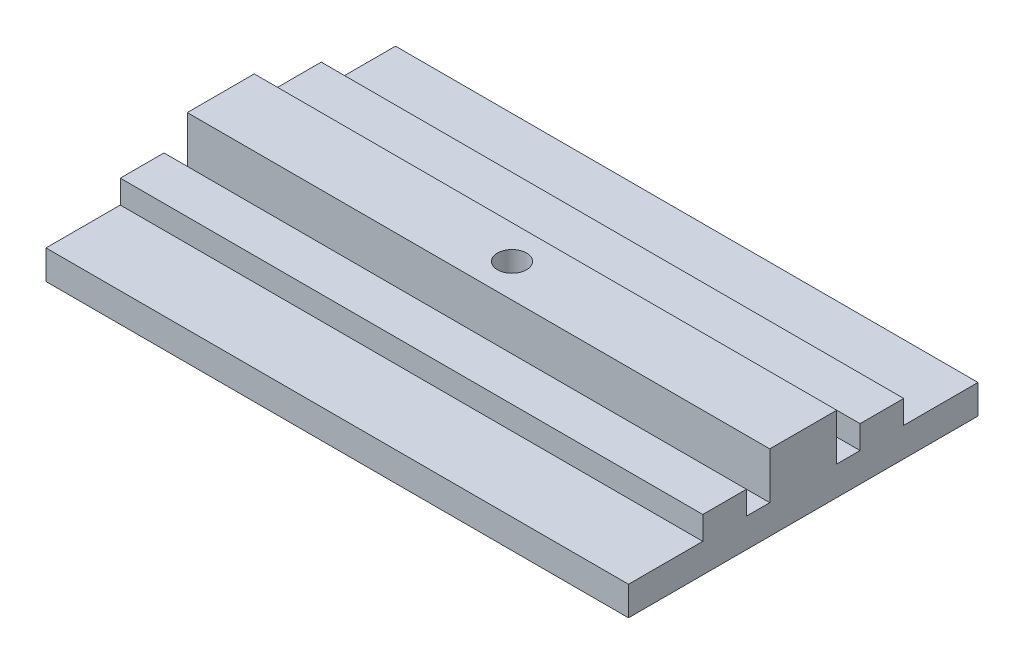
ISO-10303-21;
HEADER;
FILE_DESCRIPTION(('STEP AP214'),'2;1');
FILE_NAME('part.step','',(''),(''),'','','');
FILE_SCHEMA(('AUTOMOTIVE_DESIGN { 1 0 10303 214 1 1 1 1 }'));
ENDSEC;
DATA;
#1=APPLICATION_CONTEXT('core data for automotive mechanical design processes');
#2=APPLICATION_PROTOCOL_DEFINITION('international standard','automotive_design',2000,#1);
#3=PRODUCT_CONTEXT('',#1,'mechanical');
#4=PRODUCT('Part','Part','',(#3));
#5=PRODUCT_RELATED_PRODUCT_CATEGORY('part','',(#4));
#6=PRODUCT_DEFINITION_FORMATION('','',#4);
#7=PRODUCT_DEFINITION_CONTEXT('part definition',#1,'design');
#8=PRODUCT_DEFINITION('design','',#6,#7);
#9=PRODUCT_DEFINITION_SHAPE('','',#8);
#10=(LENGTH_UNIT() NAMED_UNIT(*) SI_UNIT(.MILLI.,.METRE.));
#11=(NAMED_UNIT(*) PLANE_ANGLE_UNIT() SI_UNIT($,.RADIAN.));
#12=(NAMED_UNIT(*) SI_UNIT($,.STERADIAN.) SOLID_ANGLE_UNIT());
#13=UNCERTAINTY_MEASURE_WITH_UNIT(LENGTH_MEASURE(1.E-05),#10,'distance_accuracy_value','');
#14=(GEOMETRIC_REPRESENTATION_CONTEXT(3) GLOBAL_UNCERTAINTY_ASSIGNED_CONTEXT((#13)) GLOBAL_UNIT_ASSIGNED_CONTEXT((#10,
#11,#12)) REPRESENTATION_CONTEXT('',''));
#15=CARTESIAN_POINT('',(0.,0.,0.));
#16=DIRECTION('',(0.,0.,1.));
#17=DIRECTION('',(1.,0.,0.));
#18=AXIS2_PLACEMENT_3D('',#15,#16,#17);
#19=CARTESIAN_POINT('',(0.,10.,0.));
#20=DIRECTION('',(0.,-1.,0.));
#21=DIRECTION('',(0.,0.,-1.));
#22=AXIS2_PLACEMENT_3D('',#19,#20,#21);
#23=PLANE('',#22);
#24=DIRECTION('',(1.,0.,0.));
#25=VECTOR('',#24,1.);
#26=CARTESIAN_POINT('',(-100.,10.,11.5));
#27=LINE('',#26,#25);
#28=CARTESIAN_POINT('',(-100.,10.,11.5));
#29=VERTEX_POINT('',#28);
#30=CARTESIAN_POINT('',(100.,10.,11.5));
#31=VERTEX_POINT('',#30);
#32=EDGE_CURVE('E180',#29,#31,#27,.T.);
#33=ORIENTED_EDGE('',*,*,#32,.F.);
#34=DIRECTION('',(0.,0.,1.));
#35=VECTOR('',#34,1.);
#36=CARTESIAN_POINT('',(-100.,10.,60.));
#37=LINE('',#36,#35);
#38=CARTESIAN_POINT('',(-100.,10.,19.499));
#39=VERTEX_POINT('',#38);
#40=EDGE_CURVE('E263',#29,#39,#37,.T.);
#41=ORIENTED_EDGE('',*,*,#40,.T.);
#42=DIRECTION('',(-1.,0.,0.));
#43=VECTOR('',#42,1.);
#44=CARTESIAN_POINT('',(-100.,10.,19.499));
#45=LINE('',#44,#43);
#46=CARTESIAN_POINT('',(100.,10.,19.499));
#47=VERTEX_POINT('',#46);
#48=EDGE_CURVE('E213',#47,#39,#45,.T.);
#49=ORIENTED_EDGE('',*,*,#48,.F.);
#50=DIRECTION('',(0.,0.,-1.));
#51=VECTOR('',#50,1.);
#52=CARTESIAN_POINT('',(100.,10.,60.));
#53=LINE('',#52,#51);
#54=EDGE_CURVE('E66',#47,#31,#53,.T.);
#55=ORIENTED_EDGE('',*,*,#54,.T.);
#56=EDGE_LOOP('',(#33,#41,#49,#55));
#57=FACE_BOUND('',#56,.T.);
#58=ADVANCED_FACE('F43',(#57),#23,.F.);
#59=CARTESIAN_POINT('',(-100.,10.,-19.499));
#60=VERTEX_POINT('',#59);
#61=CARTESIAN_POINT('',(-100.,10.,-11.5));
#62=VERTEX_POINT('',#61);
#63=EDGE_CURVE('E262',#60,#62,#37,.T.);
#64=ORIENTED_EDGE('',*,*,#63,.T.);
#65=DIRECTION('',(1.,0.,0.));
#66=VECTOR('',#65,1.);
#67=CARTESIAN_POINT('',(-100.,10.,-11.5));
#68=LINE('',#67,#66);
#69=CARTESIAN_POINT('',(100.,10.,-11.5));
#70=VERTEX_POINT('',#69);
#71=EDGE_CURVE('E58',#62,#70,#68,.T.);
#72=ORIENTED_EDGE('',*,*,#71,.T.);
#73=CARTESIAN_POINT('',(100.,10.,-19.499));
#74=VERTEX_POINT('',#73);
#75=EDGE_CURVE('E255',#70,#74,#53,.T.);
#76=ORIENTED_EDGE('',*,*,#75,.T.);
#77=DIRECTION('',(1.,0.,0.));
#78=VECTOR('',#77,1.);
#79=CARTESIAN_POINT('',(-100.,10.,-19.499));
#80=LINE('',#79,#78);
#81=EDGE_CURVE('E229',#60,#74,#80,.T.);
#82=ORIENTED_EDGE('',*,*,#81,.F.);
#83=EDGE_LOOP('',(#64,#72,#76,#82));
#84=FACE_BOUND('',#83,.T.);
#85=ADVANCED_FACE('F306',(#84),#23,.F.);
#86=DIRECTION('',(1.,0.,0.));
#87=VECTOR('',#86,1.);
#88=CARTESIAN_POINT('',(-100.,10.,34.499));
#89=LINE('',#88,#87);
#90=CARTESIAN_POINT('',(-100.,10.,34.499));
#91=VERTEX_POINT('',#90);
#92=CARTESIAN_POINT('',(100.,10.,34.499));
#93=VERTEX_POINT('',#92);
#94=EDGE_CURVE('E210',#91,#93,#89,.T.);
#95=ORIENTED_EDGE('',*,*,#94,.F.);
#96=CARTESIAN_POINT('',(-100.,10.,60.));
#97=VERTEX_POINT('',#96);
#98=EDGE_CURVE('E258',#91,#97,#37,.T.);
#99=ORIENTED_EDGE('',*,*,#98,.T.);
#100=DIRECTION('',(1.,0.,0.));
#101=VECTOR('',#100,1.);
#102=CARTESIAN_POINT('',(-100.,10.,60.));
#103=LINE('',#102,#101);
#104=CARTESIAN_POINT('',(100.,10.,60.));
#105=VERTEX_POINT('',#104);
#106=EDGE_CURVE('E261',#97,#105,#103,.T.);
#107=ORIENTED_EDGE('',*,*,#106,.T.);
#108=EDGE_CURVE('E252',#105,#93,#53,.T.);
#109=ORIENTED_EDGE('',*,*,#108,.T.);
#110=EDGE_LOOP('',(#95,#99,#107,#109));
#111=FACE_BOUND('',#110,.T.);
#112=ADVANCED_FACE('F300',(#111),#23,.F.);
#113=DIRECTION('',(-1.,0.,0.));
#114=VECTOR('',#113,1.);
#115=CARTESIAN_POINT('',(-100.,10.,-34.499));
#116=LINE('',#115,#114);
#117=CARTESIAN_POINT('',(100.,10.,-34.499));
#118=VERTEX_POINT('',#117);
#119=CARTESIAN_POINT('',(-100.,10.,-34.499));
#120=VERTEX_POINT('',#119);
#121=EDGE_CURVE('E217',#118,#120,#116,.T.);
#122=ORIENTED_EDGE('',*,*,#121,.F.);
#123=CARTESIAN_POINT('',(100.,10.,-60.));
#124=VERTEX_POINT('',#123);
#125=EDGE_CURVE('E256',#118,#124,#53,.T.);
#126=ORIENTED_EDGE('',*,*,#125,.T.);
#127=DIRECTION('',(-1.,0.,0.));
#128=VECTOR('',#127,1.);
#129=CARTESIAN_POINT('',(-100.,10.,-60.));
#130=LINE('',#129,#128);
#131=CARTESIAN_POINT('',(-100.,10.,-60.));
#132=VERTEX_POINT('',#131);
#133=EDGE_CURVE('E254',#124,#132,#130,.T.);
#134=ORIENTED_EDGE('',*,*,#133,.T.);
#135=EDGE_CURVE('E259',#132,#120,#37,.T.);
#136=ORIENTED_EDGE('',*,*,#135,.T.);
#137=EDGE_LOOP('',(#122,#126,#134,#136));
#138=FACE_BOUND('',#137,.T.);
#139=ADVANCED_FACE('F322',(#138),#23,.F.);
#140=CARTESIAN_POINT('',(100.,10.,60.));
#141=DIRECTION('',(-1.,0.,0.));
#142=DIRECTION('',(0.,0.,1.));
#143=AXIS2_PLACEMENT_3D('',#140,#141,#142);
#144=PLANE('',#143);
#145=DIRECTION('',(0.,0.,-1.));
#146=VECTOR('',#145,1.);
#147=CARTESIAN_POINT('',(100.,0.,60.));
#148=LINE('',#147,#146);
#149=CARTESIAN_POINT('',(100.,0.,60.));
#150=VERTEX_POINT('',#149);
#151=CARTESIAN_POINT('',(100.,0.,-60.));
#152=VERTEX_POINT('',#151);
#153=EDGE_CURVE('E251',#150,#152,#148,.T.);
#154=ORIENTED_EDGE('',*,*,#153,.T.);
#155=DIRECTION('',(0.,-1.,0.));
#156=VECTOR('',#155,1.);
#157=CARTESIAN_POINT('',(100.,10.,-60.));
#158=LINE('',#157,#156);
#159=EDGE_CURVE('E11',#124,#152,#158,.T.);
#160=ORIENTED_EDGE('',*,*,#159,.F.);
#161=ORIENTED_EDGE('',*,*,#125,.F.);
#162=DIRECTION('',(0.,-1.,0.));
#163=VECTOR('',#162,1.);
#164=CARTESIAN_POINT('',(100.,18.,-34.499));
#165=LINE('',#164,#163);
#166=CARTESIAN_POINT('',(100.,18.,-34.499));
#167=VERTEX_POINT('',#166);
#168=EDGE_CURVE('E248',#167,#118,#165,.T.);
#169=ORIENTED_EDGE('',*,*,#168,.F.);
#170=DIRECTION('',(0.,0.,-1.));
#171=VECTOR('',#170,1.);
#172=CARTESIAN_POINT('',(100.,18.,-34.499));
#173=LINE('',#172,#171);
#174=CARTESIAN_POINT('',(100.,18.,-19.499));
#175=VERTEX_POINT('',#174);
#176=EDGE_CURVE('E225',#175,#167,#173,.T.);
#177=ORIENTED_EDGE('',*,*,#176,.F.);
#178=DIRECTION('',(0.,-1.,0.));
#179=VECTOR('',#178,1.);
#180=CARTESIAN_POINT('',(100.,18.,-19.499));
#181=LINE('',#180,#179);
#182=EDGE_CURVE('E235',#175,#74,#181,.T.);
#183=ORIENTED_EDGE('',*,*,#182,.T.);
#184=ORIENTED_EDGE('',*,*,#75,.F.);
#185=DIRECTION('',(0.,-1.,0.));
#186=VECTOR('',#185,1.);
#187=CARTESIAN_POINT('',(100.,26.,-11.5));
#188=LINE('',#187,#186);
#189=CARTESIAN_POINT('',(100.,26.,-11.5));
#190=VERTEX_POINT('',#189);
#191=EDGE_CURVE('E165',#190,#70,#188,.T.);
#192=ORIENTED_EDGE('',*,*,#191,.F.);
#193=DIRECTION('',(0.,0.,-1.));
#194=VECTOR('',#193,1.);
#195=CARTESIAN_POINT('',(100.,26.,11.5));
#196=LINE('',#195,#194);
#197=CARTESIAN_POINT('',(100.,26.,11.5));
#198=VERTEX_POINT('',#197);
#199=EDGE_CURVE('E173',#198,#190,#196,.T.);
#200=ORIENTED_EDGE('',*,*,#199,.F.);
#201=DIRECTION('',(0.,-1.,0.));
#202=VECTOR('',#201,1.);
#203=CARTESIAN_POINT('',(100.,26.,11.5));
#204=LINE('',#203,#202);
#205=EDGE_CURVE('E191',#198,#31,#204,.T.);
#206=ORIENTED_EDGE('',*,*,#205,.T.);
#207=ORIENTED_EDGE('',*,*,#54,.F.);
#208=DIRECTION('',(0.,-1.,0.));
#209=VECTOR('',#208,1.);
#210=CARTESIAN_POINT('',(100.,18.,19.499));
#211=LINE('',#210,#209);
#212=CARTESIAN_POINT('',(100.,18.,19.499));
#213=VERTEX_POINT('',#212);
#214=EDGE_CURVE('E197',#213,#47,#211,.T.);
#215=ORIENTED_EDGE('',*,*,#214,.F.);
#216=DIRECTION('',(0.,0.,-1.));
#217=VECTOR('',#216,1.);
#218=CARTESIAN_POINT('',(100.,18.,19.499));
#219=LINE('',#218,#217);
#220=CARTESIAN_POINT('',(100.,18.,34.499));
#221=VERTEX_POINT('',#220);
#222=EDGE_CURVE('E214',#221,#213,#219,.T.);
#223=ORIENTED_EDGE('',*,*,#222,.F.);
#224=DIRECTION('',(0.,-1.,0.));
#225=VECTOR('',#224,1.);
#226=CARTESIAN_POINT('',(100.,18.,34.499));
#227=LINE('',#226,#225);
#228=EDGE_CURVE('E206',#221,#93,#227,.T.);
#229=ORIENTED_EDGE('',*,*,#228,.T.);
#230=ORIENTED_EDGE('',*,*,#108,.F.);
#231=DIRECTION('',(0.,-1.,0.));
#232=VECTOR('',#231,1.);
#233=CARTESIAN_POINT('',(100.,10.,60.));
#234=LINE('',#233,#232);
#235=EDGE_CURVE('E265',#105,#150,#234,.T.);
#236=ORIENTED_EDGE('',*,*,#235,.T.);
#237=EDGE_LOOP('',(#154,#160,#161,#169,#177,#183,#184,#192,#200,#206,#207,#215,#223,#229,#230,#236));
#238=FACE_BOUND('',#237,.T.);
#239=ADVANCED_FACE('F45',(#238),#144,.F.);
#240=CARTESIAN_POINT('',(-100.,10.,-60.));
#241=DIRECTION('',(0.,0.,1.));
#242=DIRECTION('',(1.,0.,0.));
#243=AXIS2_PLACEMENT_3D('',#240,#241,#242);
#244=PLANE('',#243);
#245=DIRECTION('',(-1.,0.,0.));
#246=VECTOR('',#245,1.);
#247=CARTESIAN_POINT('',(-100.,0.,-60.));
#248=LINE('',#247,#246);
#249=CARTESIAN_POINT('',(-100.,0.,-60.));
#250=VERTEX_POINT('',#249);
#251=EDGE_CURVE('E268',#152,#250,#248,.T.);
#252=ORIENTED_EDGE('',*,*,#251,.T.);
#253=DIRECTION('',(0.,-1.,0.));
#254=VECTOR('',#253,1.);
#255=CARTESIAN_POINT('',(-100.,10.,-60.));
#256=LINE('',#255,#254);
#257=EDGE_CURVE('E51',#132,#250,#256,.T.);
#258=ORIENTED_EDGE('',*,*,#257,.F.);
#259=ORIENTED_EDGE('',*,*,#133,.F.);
#260=ORIENTED_EDGE('',*,*,#159,.T.);
#261=EDGE_LOOP('',(#252,#258,#259,#260));
#262=FACE_BOUND('',#261,.T.);
#263=ADVANCED_FACE('F357',(#262),#244,.F.);
#264=CARTESIAN_POINT('',(-100.,10.,60.));
#265=DIRECTION('',(1.,0.,0.));
#266=DIRECTION('',(0.,0.,-1.));
#267=AXIS2_PLACEMENT_3D('',#264,#265,#266);
#268=PLANE('',#267);
#269=DIRECTION('',(0.,0.,1.));
#270=VECTOR('',#269,1.);
#271=CARTESIAN_POINT('',(-100.,0.,60.));
#272=LINE('',#271,#270);
#273=CARTESIAN_POINT('',(-100.,0.,60.));
#274=VERTEX_POINT('',#273);
#275=EDGE_CURVE('E270',#250,#274,#272,.T.);
#276=ORIENTED_EDGE('',*,*,#275,.T.);
#277=DIRECTION('',(0.,-1.,0.));
#278=VECTOR('',#277,1.);
#279=CARTESIAN_POINT('',(-100.,10.,60.));
#280=LINE('',#279,#278);
#281=EDGE_CURVE('E276',#97,#274,#280,.T.);
#282=ORIENTED_EDGE('',*,*,#281,.F.);
#283=ORIENTED_EDGE('',*,*,#98,.F.);
#284=DIRECTION('',(0.,-1.,0.));
#285=VECTOR('',#284,1.);
#286=CARTESIAN_POINT('',(-100.,18.,34.499));
#287=LINE('',#286,#285);
#288=CARTESIAN_POINT('',(-100.,18.,34.499));
#289=VERTEX_POINT('',#288);
#290=EDGE_CURVE('E203',#289,#91,#287,.T.);
#291=ORIENTED_EDGE('',*,*,#290,.F.);
#292=DIRECTION('',(0.,0.,1.));
#293=VECTOR('',#292,1.);
#294=CARTESIAN_POINT('',(-100.,18.,19.499));
#295=LINE('',#294,#293);
#296=CARTESIAN_POINT('',(-100.,18.,19.499));
#297=VERTEX_POINT('',#296);
#298=EDGE_CURVE('E219',#297,#289,#295,.T.);
#299=ORIENTED_EDGE('',*,*,#298,.F.);
#300=DIRECTION('',(0.,-1.,0.));
#301=VECTOR('',#300,1.);
#302=CARTESIAN_POINT('',(-100.,18.,19.499));
#303=LINE('',#302,#301);
#304=EDGE_CURVE('E200',#297,#39,#303,.T.);
#305=ORIENTED_EDGE('',*,*,#304,.T.);
#306=ORIENTED_EDGE('',*,*,#40,.F.);
#307=DIRECTION('',(0.,-1.,0.));
#308=VECTOR('',#307,1.);
#309=CARTESIAN_POINT('',(-100.,26.,11.5));
#310=LINE('',#309,#308);
#311=CARTESIAN_POINT('',(-100.,26.,11.5));
#312=VERTEX_POINT('',#311);
#313=EDGE_CURVE('E178',#312,#29,#310,.T.);
#314=ORIENTED_EDGE('',*,*,#313,.F.);
#315=DIRECTION('',(0.,0.,-1.));
#316=VECTOR('',#315,1.);
#317=CARTESIAN_POINT('',(-100.,26.,11.5));
#318=LINE('',#317,#316);
#319=CARTESIAN_POINT('',(-100.,26.,-11.5));
#320=VERTEX_POINT('',#319);
#321=EDGE_CURVE('E171',#312,#320,#318,.T.);
#322=ORIENTED_EDGE('',*,*,#321,.T.);
#323=DIRECTION('',(0.,-1.,0.));
#324=VECTOR('',#323,1.);
#325=CARTESIAN_POINT('',(-100.,26.,-11.5));
#326=LINE('',#325,#324);
#327=EDGE_CURVE('E157',#320,#62,#326,.T.);
#328=ORIENTED_EDGE('',*,*,#327,.T.);
#329=ORIENTED_EDGE('',*,*,#63,.F.);
#330=DIRECTION('',(0.,-1.,0.));
#331=VECTOR('',#330,1.);
#332=CARTESIAN_POINT('',(-100.,18.,-19.499));
#333=LINE('',#332,#331);
#334=CARTESIAN_POINT('',(-100.,18.,-19.499));
#335=VERTEX_POINT('',#334);
#336=EDGE_CURVE('E242',#335,#60,#333,.T.);
#337=ORIENTED_EDGE('',*,*,#336,.F.);
#338=DIRECTION('',(0.,0.,1.));
#339=VECTOR('',#338,1.);
#340=CARTESIAN_POINT('',(-100.,18.,-34.499));
#341=LINE('',#340,#339);
#342=CARTESIAN_POINT('',(-100.,18.,-34.499));
#343=VERTEX_POINT('',#342);
#344=EDGE_CURVE('E231',#343,#335,#341,.T.);
#345=ORIENTED_EDGE('',*,*,#344,.F.);
#346=DIRECTION('',(0.,-1.,0.));
#347=VECTOR('',#346,1.);
#348=CARTESIAN_POINT('',(-100.,18.,-34.499));
#349=LINE('',#348,#347);
#350=EDGE_CURVE('E245',#343,#120,#349,.T.);
#351=ORIENTED_EDGE('',*,*,#350,.T.);
#352=ORIENTED_EDGE('',*,*,#135,.F.);
#353=ORIENTED_EDGE('',*,*,#257,.T.);
#354=EDGE_LOOP('',(#276,#282,#283,#291,#299,#305,#306,#314,#322,#328,#329,#337,#345,#351,#352,#353));
#355=FACE_BOUND('',#354,.T.);
#356=ADVANCED_FACE('F176',(#355),#268,.F.);
#357=CARTESIAN_POINT('',(-100.,10.,60.));
#358=DIRECTION('',(0.,0.,-1.));
#359=DIRECTION('',(-1.,0.,0.));
#360=AXIS2_PLACEMENT_3D('',#357,#358,#359);
#361=PLANE('',#360);
#362=DIRECTION('',(1.,0.,0.));
#363=VECTOR('',#362,1.);
#364=CARTESIAN_POINT('',(-100.,0.,60.));
#365=LINE('',#364,#363);
#366=EDGE_CURVE('E272',#274,#150,#365,.T.);
#367=ORIENTED_EDGE('',*,*,#366,.T.);
#368=ORIENTED_EDGE('',*,*,#235,.F.);
#369=ORIENTED_EDGE('',*,*,#106,.F.);
#370=ORIENTED_EDGE('',*,*,#281,.T.);
#371=EDGE_LOOP('',(#367,#368,#369,#370));
#372=FACE_BOUND('',#371,.T.);
#373=ADVANCED_FACE('F291',(#372),#361,.F.);
#374=CARTESIAN_POINT('',(0.,0.,0.));
#375=DIRECTION('',(0.,-1.,0.));
#376=DIRECTION('',(0.,0.,-1.));
#377=AXIS2_PLACEMENT_3D('',#374,#375,#376);
#378=PLANE('',#377);
#379=CARTESIAN_POINT('',(0.,0.,0.));
#380=DIRECTION('',(0.,1.,0.));
#381=DIRECTION('',(0.,0.,1.));
#382=AXIS2_PLACEMENT_3D('',#379,#380,#381);
#383=CIRCLE('',#382,5.);
#384=CARTESIAN_POINT('',(0.,0.,5.));
#385=VERTEX_POINT('',#384);
#386=EDGE_CURVE('E190',#385,#385,#383,.T.);
#387=ORIENTED_EDGE('',*,*,#386,.T.);
#388=EDGE_LOOP('',(#387));
#389=FACE_BOUND('',#388,.T.);
#390=ORIENTED_EDGE('',*,*,#153,.F.);
#391=ORIENTED_EDGE('',*,*,#366,.F.);
#392=ORIENTED_EDGE('',*,*,#275,.F.);
#393=ORIENTED_EDGE('',*,*,#251,.F.);
#394=EDGE_LOOP('',(#390,#391,#392,#393));
#395=FACE_BOUND('',#394,.T.);
#396=ADVANCED_FACE('F288',(#389,#395),#378,.T.);
#397=CARTESIAN_POINT('',(-100.,18.,-34.499));
#398=DIRECTION('',(0.,0.,1.));
#399=DIRECTION('',(1.,0.,0.));
#400=AXIS2_PLACEMENT_3D('',#397,#398,#399);
#401=PLANE('',#400);
#402=ORIENTED_EDGE('',*,*,#121,.T.);
#403=ORIENTED_EDGE('',*,*,#350,.F.);
#404=DIRECTION('',(-1.,0.,0.));
#405=VECTOR('',#404,1.);
#406=CARTESIAN_POINT('',(-100.,18.,-34.499));
#407=LINE('',#406,#405);
#408=EDGE_CURVE('E228',#167,#343,#407,.T.);
#409=ORIENTED_EDGE('',*,*,#408,.F.);
#410=ORIENTED_EDGE('',*,*,#168,.T.);
#411=EDGE_LOOP('',(#402,#403,#409,#410));
#412=FACE_BOUND('',#411,.T.);
#413=ADVANCED_FACE('F319',(#412),#401,.F.);
#414=CARTESIAN_POINT('',(-100.,18.,-19.499));
#415=DIRECTION('',(0.,0.,-1.));
#416=DIRECTION('',(-1.,0.,0.));
#417=AXIS2_PLACEMENT_3D('',#414,#415,#416);
#418=PLANE('',#417);
#419=ORIENTED_EDGE('',*,*,#81,.T.);
#420=ORIENTED_EDGE('',*,*,#182,.F.);
#421=DIRECTION('',(1.,0.,0.));
#422=VECTOR('',#421,1.);
#423=CARTESIAN_POINT('',(-100.,18.,-19.499));
#424=LINE('',#423,#422);
#425=EDGE_CURVE('E233',#335,#175,#424,.T.);
#426=ORIENTED_EDGE('',*,*,#425,.F.);
#427=ORIENTED_EDGE('',*,*,#336,.T.);
#428=EDGE_LOOP('',(#419,#420,#426,#427));
#429=FACE_BOUND('',#428,.T.);
#430=ADVANCED_FACE('F311',(#429),#418,.F.);
#431=CARTESIAN_POINT('',(0.,18.,0.));
#432=DIRECTION('',(0.,1.,0.));
#433=DIRECTION('',(0.,0.,1.));
#434=AXIS2_PLACEMENT_3D('',#431,#432,#433);
#435=PLANE('',#434);
#436=ORIENTED_EDGE('',*,*,#176,.T.);
#437=ORIENTED_EDGE('',*,*,#408,.T.);
#438=ORIENTED_EDGE('',*,*,#344,.T.);
#439=ORIENTED_EDGE('',*,*,#425,.T.);
#440=EDGE_LOOP('',(#436,#437,#438,#439));
#441=FACE_BOUND('',#440,.T.);
#442=ADVANCED_FACE('F315',(#441),#435,.T.);
#443=CARTESIAN_POINT('',(-100.,18.,19.499));
#444=DIRECTION('',(0.,0.,1.));
#445=DIRECTION('',(1.,0.,0.));
#446=AXIS2_PLACEMENT_3D('',#443,#444,#445);
#447=PLANE('',#446);
#448=ORIENTED_EDGE('',*,*,#48,.T.);
#449=ORIENTED_EDGE('',*,*,#304,.F.);
#450=DIRECTION('',(-1.,0.,0.));
#451=VECTOR('',#450,1.);
#452=CARTESIAN_POINT('',(-100.,18.,19.499));
#453=LINE('',#452,#451);
#454=EDGE_CURVE('E221',#213,#297,#453,.T.);
#455=ORIENTED_EDGE('',*,*,#454,.F.);
#456=ORIENTED_EDGE('',*,*,#214,.T.);
#457=EDGE_LOOP('',(#448,#449,#455,#456));
#458=FACE_BOUND('',#457,.T.);
#459=ADVANCED_FACE('F329',(#458),#447,.F.);
#460=CARTESIAN_POINT('',(-100.,18.,34.499));
#461=DIRECTION('',(0.,0.,-1.));
#462=DIRECTION('',(-1.,0.,0.));
#463=AXIS2_PLACEMENT_3D('',#460,#461,#462);
#464=PLANE('',#463);
#465=ORIENTED_EDGE('',*,*,#94,.T.);
#466=ORIENTED_EDGE('',*,*,#228,.F.);
#467=DIRECTION('',(1.,0.,0.));
#468=VECTOR('',#467,1.);
#469=CARTESIAN_POINT('',(-100.,18.,34.499));
#470=LINE('',#469,#468);
#471=EDGE_CURVE('E209',#289,#221,#470,.T.);
#472=ORIENTED_EDGE('',*,*,#471,.F.);
#473=ORIENTED_EDGE('',*,*,#290,.T.);
#474=EDGE_LOOP('',(#465,#466,#472,#473));
#475=FACE_BOUND('',#474,.T.);
#476=ADVANCED_FACE('F302',(#475),#464,.F.);
#477=CARTESIAN_POINT('',(0.,18.,0.));
#478=DIRECTION('',(0.,1.,0.));
#479=DIRECTION('',(0.,0.,1.));
#480=AXIS2_PLACEMENT_3D('',#477,#478,#479);
#481=PLANE('',#480);
#482=ORIENTED_EDGE('',*,*,#222,.T.);
#483=ORIENTED_EDGE('',*,*,#454,.T.);
#484=ORIENTED_EDGE('',*,*,#298,.T.);
#485=ORIENTED_EDGE('',*,*,#471,.T.);
#486=EDGE_LOOP('',(#482,#483,#484,#485));
#487=FACE_BOUND('',#486,.T.);
#488=ADVANCED_FACE('F331',(#487),#481,.T.);
#489=CARTESIAN_POINT('',(0.,0.,0.));
#490=DIRECTION('',(0.,1.,0.));
#491=DIRECTION('',(0.,0.,1.));
#492=AXIS2_PLACEMENT_3D('',#489,#490,#491);
#493=CYLINDRICAL_SURFACE('',#492,5.);
#494=ORIENTED_EDGE('',*,*,#386,.F.);
#495=EDGE_LOOP('',(#494));
#496=FACE_BOUND('',#495,.T.);
#497=CARTESIAN_POINT('',(0.,26.,0.));
#498=DIRECTION('',(0.,1.,0.));
#499=DIRECTION('',(0.,0.,1.));
#500=AXIS2_PLACEMENT_3D('',#497,#498,#499);
#501=CIRCLE('',#500,5.);
#502=CARTESIAN_POINT('',(0.,26.,5.));
#503=VERTEX_POINT('',#502);
#504=EDGE_CURVE('E184',#503,#503,#501,.T.);
#505=ORIENTED_EDGE('',*,*,#504,.T.);
#506=EDGE_LOOP('',(#505));
#507=FACE_BOUND('',#506,.T.);
#508=ADVANCED_FACE('F333',(#496,#507),#493,.F.);
#509=CARTESIAN_POINT('',(-100.,26.,11.5));
#510=DIRECTION('',(0.,0.,-1.));
#511=DIRECTION('',(-1.,0.,0.));
#512=AXIS2_PLACEMENT_3D('',#509,#510,#511);
#513=PLANE('',#512);
#514=ORIENTED_EDGE('',*,*,#32,.T.);
#515=ORIENTED_EDGE('',*,*,#205,.F.);
#516=DIRECTION('',(1.,0.,0.));
#517=VECTOR('',#516,1.);
#518=CARTESIAN_POINT('',(-100.,26.,11.5));
#519=LINE('',#518,#517);
#520=EDGE_CURVE('E166',#312,#198,#519,.T.);
#521=ORIENTED_EDGE('',*,*,#520,.F.);
#522=ORIENTED_EDGE('',*,*,#313,.T.);
#523=EDGE_LOOP('',(#514,#515,#521,#522));
#524=FACE_BOUND('',#523,.T.);
#525=ADVANCED_FACE('F326',(#524),#513,.F.);
#526=CARTESIAN_POINT('',(-100.,26.,-11.5));
#527=DIRECTION('',(0.,0.,-1.));
#528=DIRECTION('',(-1.,0.,0.));
#529=AXIS2_PLACEMENT_3D('',#526,#527,#528);
#530=PLANE('',#529);
#531=ORIENTED_EDGE('',*,*,#71,.F.);
#532=ORIENTED_EDGE('',*,*,#327,.F.);
#533=DIRECTION('',(1.,0.,0.));
#534=VECTOR('',#533,1.);
#535=CARTESIAN_POINT('',(-100.,26.,-11.5));
#536=LINE('',#535,#534);
#537=EDGE_CURVE('E161',#320,#190,#536,.T.);
#538=ORIENTED_EDGE('',*,*,#537,.T.);
#539=ORIENTED_EDGE('',*,*,#191,.T.);
#540=EDGE_LOOP('',(#531,#532,#538,#539));
#541=FACE_BOUND('',#540,.T.);
#542=ADVANCED_FACE('F159',(#541),#530,.T.);
#543=CARTESIAN_POINT('',(0.,26.,0.));
#544=DIRECTION('',(0.,-1.,0.));
#545=DIRECTION('',(0.,0.,-1.));
#546=AXIS2_PLACEMENT_3D('',#543,#544,#545);
#547=PLANE('',#546);
#548=ORIENTED_EDGE('',*,*,#504,.F.);
#549=EDGE_LOOP('',(#548));
#550=FACE_BOUND('',#549,.T.);
#551=ORIENTED_EDGE('',*,*,#321,.F.);
#552=ORIENTED_EDGE('',*,*,#520,.T.);
#553=ORIENTED_EDGE('',*,*,#199,.T.);
#554=ORIENTED_EDGE('',*,*,#537,.F.);
#555=EDGE_LOOP('',(#551,#552,#553,#554));
#556=FACE_BOUND('',#555,.T.);
#557=ADVANCED_FACE('F170',(#550,#556),#547,.F.);
#558=CLOSED_SHELL('',(#58,#85,#112,#139,#239,#263,#356,#373,#396,#413,#430,#442,#459,#476,#488,
#508,#525,#542,#557));
#559=MANIFOLD_SOLID_BREP('B2',#558);
#560=ADVANCED_BREP_SHAPE_REPRESENTATION('',(#18,#559),#14);
#561=SHAPE_DEFINITION_REPRESENTATION(#9,#560);
ENDSEC;
END-ISO-10303-21;
